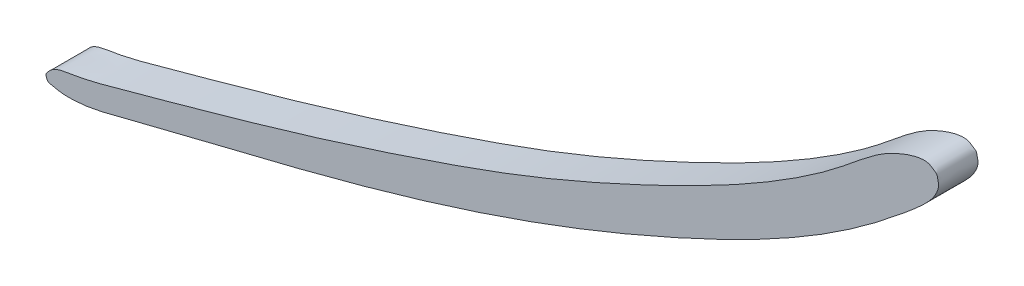
ISO-10303-21;
HEADER;
FILE_DESCRIPTION(('STEP AP214'),'2;1');
FILE_NAME('part.step','',(''),(''),'','','');
FILE_SCHEMA(('AUTOMOTIVE_DESIGN { 1 0 10303 214 1 1 1 1 }'));
ENDSEC;
DATA;
#1=APPLICATION_CONTEXT('core data for automotive mechanical design processes');
#2=APPLICATION_PROTOCOL_DEFINITION('international standard','automotive_design',2000,#1);
#3=PRODUCT_CONTEXT('',#1,'mechanical');
#4=PRODUCT('Part','Part','',(#3));
#5=PRODUCT_RELATED_PRODUCT_CATEGORY('part','',(#4));
#6=PRODUCT_DEFINITION_FORMATION('','',#4);
#7=PRODUCT_DEFINITION_CONTEXT('part definition',#1,'design');
#8=PRODUCT_DEFINITION('design','',#6,#7);
#9=PRODUCT_DEFINITION_SHAPE('','',#8);
#10=(LENGTH_UNIT() NAMED_UNIT(*) SI_UNIT(.MILLI.,.METRE.));
#11=(NAMED_UNIT(*) PLANE_ANGLE_UNIT() SI_UNIT($,.RADIAN.));
#12=(NAMED_UNIT(*) SI_UNIT($,.STERADIAN.) SOLID_ANGLE_UNIT());
#13=UNCERTAINTY_MEASURE_WITH_UNIT(LENGTH_MEASURE(1.E-05),#10,'distance_accuracy_value','');
#14=(GEOMETRIC_REPRESENTATION_CONTEXT(3) GLOBAL_UNCERTAINTY_ASSIGNED_CONTEXT((#13)) GLOBAL_UNIT_ASSIGNED_CONTEXT((#10,
#11,#12)) REPRESENTATION_CONTEXT('',''));
#15=CARTESIAN_POINT('',(0.,0.,0.));
#16=DIRECTION('',(0.,0.,1.));
#17=DIRECTION('',(1.,0.,0.));
#18=AXIS2_PLACEMENT_3D('',#15,#16,#17);
#19=CARTESIAN_POINT('',(98.4237961765209,0.,204.));
#20=CARTESIAN_POINT('',(98.3589321661085,0.117288758502057,204.));
#21=CARTESIAN_POINT('',(98.2555818104065,0.202564729120433,204.));
#22=CARTESIAN_POINT('',(98.0434410055772,0.360383273551998,204.));
#23=CARTESIAN_POINT('',(97.932651903241,0.432518645571887,204.));
#24=CARTESIAN_POINT('',(97.7147405538341,0.582053320782084,204.));
#25=CARTESIAN_POINT('',(97.6070945383644,0.658700731519124,204.));
#26=CARTESIAN_POINT('',(97.3860041879175,0.803671811644701,204.));
#27=CARTESIAN_POINT('',(97.2729771080006,0.872152390625252,204.));
#28=CARTESIAN_POINT('',(97.0421113784554,0.996923379218661,204.));
#29=CARTESIAN_POINT('',(96.9238911494931,1.05300562614126,204.));
#30=CARTESIAN_POINT('',(96.6772544975599,1.14211280535721,204.));
#31=CARTESIAN_POINT('',(96.5479832149782,1.17606558614761,204.));
#32=CARTESIAN_POINT('',(96.1566827190893,1.24805837221999,204.));
#33=CARTESIAN_POINT('',(95.8943750991064,1.25718228385665,204.));
#34=CARTESIAN_POINT('',(95.3683561808596,1.2375556731719,204.));
#35=CARTESIAN_POINT('',(95.1043952200779,1.20755742908412,204.));
#36=CARTESIAN_POINT('',(94.5851890793413,1.1290410605149,204.));
#37=CARTESIAN_POINT('',(94.3283558159556,1.07952635849101,204.));
#38=CARTESIAN_POINT('',(93.5652240787811,0.903698558430565,204.));
#39=CARTESIAN_POINT('',(93.0656348062729,0.752541475818979,204.));
#40=CARTESIAN_POINT('',(92.075151657459,0.418028501811125,204.));
#41=CARTESIAN_POINT('',(91.5834116559206,0.231781543556554,204.));
#42=CARTESIAN_POINT('',(90.6169647111378,-0.169679382355998,204.));
#43=CARTESIAN_POINT('',(90.1421614341095,-0.384188821590694,204.));
#44=CARTESIAN_POINT('',(88.7415009466479,-1.066581040701,204.));
#45=CARTESIAN_POINT('',(87.8402122547561,-1.57466823622007,204.));
#46=CARTESIAN_POINT('',(85.2294359781201,-3.2512638337366,204.));
#47=CARTESIAN_POINT('',(83.6045725553764,-4.55854135157364,204.));
#48=CARTESIAN_POINT('',(81.1809557429743,-6.54059740722059,204.));
#49=CARTESIAN_POINT('',(80.3739580712488,-7.20267557691391,204.));
#50=CARTESIAN_POINT('',(78.7471200845079,-8.50637973104047,204.));
#51=CARTESIAN_POINT('',(77.928186984075,-9.14945047418073,204.));
#52=CARTESIAN_POINT('',(75.4428163186501,-11.0331621926042,204.));
#53=CARTESIAN_POINT('',(73.7495133233628,-12.2310193931545,204.));
#54=CARTESIAN_POINT('',(70.3151937124524,-14.5507488291273,204.));
#55=CARTESIAN_POINT('',(68.5742280158222,-15.6727021541395,204.));
#56=CARTESIAN_POINT('',(65.0565810696821,-17.8597310191415,204.));
#57=CARTESIAN_POINT('',(63.2788452110654,-18.923127071479,204.));
#58=CARTESIAN_POINT('',(59.6867896536873,-20.9916586250141,204.));
#59=CARTESIAN_POINT('',(57.8730559887238,-21.9977273976211,204.));
#60=CARTESIAN_POINT('',(52.3903523713729,-24.9498398978238,204.));
#61=CARTESIAN_POINT('',(48.6805748856774,-26.8343754452145,204.));
#62=CARTESIAN_POINT('',(41.2030529247128,-30.4949366012721,204.));
#63=CARTESIAN_POINT('',(37.4360345766898,-32.2679143639587,204.));
#64=CARTESIAN_POINT('',(29.8586038119274,-35.7143856494283,204.));
#65=CARTESIAN_POINT('',(26.048209680678,-37.3877870740797,204.));
#66=CARTESIAN_POINT('',(18.3709391494823,-40.6047508024442,204.));
#67=CARTESIAN_POINT('',(14.5019665056862,-42.144779097204,204.));
#68=CARTESIAN_POINT('',(6.71499475776126,-45.0844528280911,204.));
#69=CARTESIAN_POINT('',(2.79627576798242,-46.4859230312784,204.));
#70=CARTESIAN_POINT('',(-5.07186437696641,-49.2056789198514,204.));
#71=CARTESIAN_POINT('',(-9.01892861882546,-50.5272387805856,204.));
#72=CARTESIAN_POINT('',(-16.9275999359106,-53.1211536614339,204.));
#73=CARTESIAN_POINT('',(-20.8907316749502,-54.3900527802076,204.));
#74=CARTESIAN_POINT('',(-28.8372796937721,-56.8631460427529,204.));
#75=CARTESIAN_POINT('',(-32.8215950707914,-58.0644721864548,204.));
#76=CARTESIAN_POINT('',(-40.8088573797893,-60.4076923026705,204.));
#77=CARTESIAN_POINT('',(-44.8120258100262,-61.5492743485377,204.));
#78=CARTESIAN_POINT('',(-52.8259967178262,-63.8042782013441,204.));
#79=CARTESIAN_POINT('',(-56.8363523820931,-64.919762149353,204.));
#80=CARTESIAN_POINT('',(-62.8536884081454,-66.5864405656361,204.));
#81=CARTESIAN_POINT('',(-64.8601221591046,-67.1396592709032,204.));
#82=CARTESIAN_POINT('',(-67.8728130234542,-67.9583109921843,204.));
#83=CARTESIAN_POINT('',(-68.8772983621898,-68.2303266520975,204.));
#84=CARTESIAN_POINT('',(-70.8872416283583,-68.7704663240672,204.));
#85=CARTESIAN_POINT('',(-71.8933313672218,-69.0360233140264,204.));
#86=CARTESIAN_POINT('',(-73.9184226434484,-69.5150232993401,204.));
#87=CARTESIAN_POINT('',(-74.9380438397189,-69.7279596335877,204.));
#88=CARTESIAN_POINT('',(-76.4774037910468,-69.993376720605,204.));
#89=CARTESIAN_POINT('',(-76.9929390346782,-70.0693874457591,204.));
#90=CARTESIAN_POINT('',(-78.021223797342,-70.2357819620433,204.));
#91=CARTESIAN_POINT('',(-78.5336582613484,-70.3277912931406,204.));
#92=CARTESIAN_POINT('',(-79.5462779427859,-70.5750104702872,204.));
#93=CARTESIAN_POINT('',(-80.0521897222114,-70.7300676133601,204.));
#94=CARTESIAN_POINT('',(-80.7388356335569,-71.0897726776899,204.));
#95=CARTESIAN_POINT('',(-80.9552136282382,-71.2334575455024,204.));
#96=CARTESIAN_POINT('',(-81.3605745493705,-71.5729340544302,204.));
#97=CARTESIAN_POINT('',(-81.5457338057735,-71.7607832200071,204.));
#98=CARTESIAN_POINT('',(-81.8126752572026,-72.0533550601342,204.));
#99=CARTESIAN_POINT('',(-81.902345124115,-72.1503402693543,204.));
#100=CARTESIAN_POINT('',(-82.0690975162195,-72.3548200120022,204.));
#101=CARTESIAN_POINT('',(-82.1500313206639,-72.4619947570133,204.));
#102=CARTESIAN_POINT('',(-82.2376872265412,-72.7118067539519,204.));
#103=CARTESIAN_POINT('',(-82.2312890236743,-72.8483373565183,204.));
#104=CARTESIAN_POINT('',(-82.1740978311282,-73.1034531809857,204.));
#105=CARTESIAN_POINT('',(-82.1287063033833,-73.2258548468859,204.));
#106=CARTESIAN_POINT('',(-82.0277878616467,-73.4675466782458,204.));
#107=CARTESIAN_POINT('',(-81.9713659204848,-73.58710030256,204.));
#108=CARTESIAN_POINT('',(-81.8511662045725,-73.7426997992616,204.));
#109=CARTESIAN_POINT('',(-81.8051243050416,-73.7886670128825,204.));
#110=CARTESIAN_POINT('',(-81.6986928897141,-73.866436412253,204.));
#111=CARTESIAN_POINT('',(-81.6404853886245,-73.89570866808,204.));
#112=CARTESIAN_POINT('',(-81.4553933247528,-73.9604511170911,204.));
#113=CARTESIAN_POINT('',(-81.3244124949358,-73.9777429240265,204.));
#114=CARTESIAN_POINT('',(-81.0658807812132,-74.0168100353915,204.));
#115=CARTESIAN_POINT('',(-80.9368538839538,-74.0376443030585,204.));
#116=CARTESIAN_POINT('',(-80.5516964011501,-74.1106155741245,204.));
#117=CARTESIAN_POINT('',(-80.2961149408665,-74.1671978866997,204.));
#118=CARTESIAN_POINT('',(-79.783958191111,-74.2736057923486,204.));
#119=CARTESIAN_POINT('',(-79.5272953753157,-74.3205800262019,204.));
#120=CARTESIAN_POINT('',(-78.7536694111281,-74.4227294202377,204.));
#121=CARTESIAN_POINT('',(-78.2339404013309,-74.4484224912163,204.));
#122=CARTESIAN_POINT('',(-77.1904341973943,-74.4566579056381,204.));
#123=CARTESIAN_POINT('',(-76.665573933379,-74.4405107345925,204.));
#124=CARTESIAN_POINT('',(-75.6252850724493,-74.3753966485418,204.));
#125=CARTESIAN_POINT('',(-75.1084052383143,-74.3259589867721,204.));
#126=CARTESIAN_POINT('',(-73.5663254677805,-74.1333852244265,204.));
#127=CARTESIAN_POINT('',(-72.5495482934839,-73.946696591942,204.));
#128=CARTESIAN_POINT('',(-70.5258882741403,-73.5221575958078,204.));
#129=CARTESIAN_POINT('',(-69.5189254532869,-73.2847207721365,204.));
#130=CARTESIAN_POINT('',(-66.5043179267363,-72.5399327524689,204.));
#131=CARTESIAN_POINT('',(-64.5015556014628,-72.0078598555902,204.));
#132=CARTESIAN_POINT('',(-60.4913777685565,-70.9660585225846,204.));
#133=CARTESIAN_POINT('',(-58.4845222216,-70.4519042228576,204.));
#134=CARTESIAN_POINT('',(-52.4569273000915,-68.9375235990113,204.));
#135=CARTESIAN_POINT('',(-48.430448181059,-67.9603124018771,204.));
#136=CARTESIAN_POINT('',(-40.3808189443848,-65.9928219864498,204.));
#137=CARTESIAN_POINT('',(-36.357819399125,-65.0018742489457,204.));
#138=CARTESIAN_POINT('',(-24.3117879696797,-61.9378931148375,204.));
#139=CARTESIAN_POINT('',(-16.3111272846816,-59.7742212431449,204.));
#140=CARTESIAN_POINT('',(-4.39646644650331,-56.2378309063148,204.));
#141=CARTESIAN_POINT('',(-0.437898842276075,-55.0107444243529,204.));
#142=CARTESIAN_POINT('',(7.44227041440742,-52.4502188360248,204.));
#143=CARTESIAN_POINT('',(11.3640432764207,-51.1167820823632,204.));
#144=CARTESIAN_POINT('',(19.1651517186535,-48.3266786111584,204.));
#145=CARTESIAN_POINT('',(23.0455840554734,-46.8697402868038,204.));
#146=CARTESIAN_POINT('',(30.7567518388619,-43.8385791612188,204.));
#147=CARTESIAN_POINT('',(34.5882138960533,-42.2643904228003,204.));
#148=CARTESIAN_POINT('',(42.2053815360214,-39.0048396648341,204.));
#149=CARTESIAN_POINT('',(45.9920329755738,-37.3190595989316,204.));
#150=CARTESIAN_POINT('',(53.5048481649036,-33.826433844837,204.));
#151=CARTESIAN_POINT('',(57.2320931931776,-32.0197655212075,204.));
#152=CARTESIAN_POINT('',(64.6005874015583,-28.2284500996939,204.));
#153=CARTESIAN_POINT('',(68.2407867095931,-26.2441762300591,204.));
#154=CARTESIAN_POINT('',(75.3642374384745,-22.0145822961899,204.));
#155=CARTESIAN_POINT('',(78.8505702618841,-19.7652837182563,204.));
#156=CARTESIAN_POINT('',(85.6111586394305,-14.971051113365,204.));
#157=CARTESIAN_POINT('',(88.8884359549304,-12.4259983337828,204.));
#158=CARTESIAN_POINT('',(92.8711289074404,-9.11103013605864,204.));
#159=CARTESIAN_POINT('',(93.6621040776665,-8.44081863790264,204.));
#160=CARTESIAN_POINT('',(94.8253883683933,-7.4099158627794,204.));
#161=CARTESIAN_POINT('',(95.2082905612714,-7.06091066387942,204.));
#162=CARTESIAN_POINT('',(95.9579799154325,-6.3450882371994,204.));
#163=CARTESIAN_POINT('',(96.3255135175857,-5.97927530229947,204.));
#164=CARTESIAN_POINT('',(97.0228293222722,-5.21778101583802,204.));
#165=CARTESIAN_POINT('',(97.3531400485585,-4.82182613696015,204.));
#166=CARTESIAN_POINT('',(97.9501868216155,-3.97722015407785,204.));
#167=CARTESIAN_POINT('',(98.2159976097107,-3.52337059041506,204.));
#168=CARTESIAN_POINT('',(98.5214873008474,-2.80818959566658,204.));
#169=CARTESIAN_POINT('',(98.6093253817105,-2.56226600661208,204.));
#170=CARTESIAN_POINT('',(98.7318088322529,-2.05369891213611,204.));
#171=CARTESIAN_POINT('',(98.7666466348802,-1.79654297089599,204.));
#172=CARTESIAN_POINT('',(98.7380938550477,-1.27154515254273,204.));
#173=CARTESIAN_POINT('',(98.6715293280656,-1.01592087417173,204.));
#174=CARTESIAN_POINT('',(98.5794195212941,-0.633385408965884,204.));
#175=CARTESIAN_POINT('',(98.5543324857936,-0.50477301455331,204.));
#176=CARTESIAN_POINT('',(98.5068441804649,-0.247021915638398,204.));
#177=CARTESIAN_POINT('',(98.4886601869333,-0.117288758502044,204.));
#178=CARTESIAN_POINT('',(98.4237961765209,0.,204.));
#179=B_SPLINE_CURVE_WITH_KNOTS('',3,(#19,#20,#21,#22,#23,#24,#25,#26,#27,#28,#29,#30,#31,#32,
#33,#34,#35,#36,#37,#38,#39,#40,#41,#42,#43,#44,#45,#46,#47,#48,#49,#50,#51,#52,#53,#54,#55,#56,
#57,#58,#59,#60,#61,#62,#63,#64,#65,#66,#67,#68,#69,#70,#71,#72,#73,#74,#75,#76,#77,#78,#79,#80,
#81,#82,#83,#84,#85,#86,#87,#88,#89,#90,#91,#92,#93,#94,#95,#96,#97,#98,#99,#100,#101,#102,#103,
#104,#105,#106,#107,#108,#109,#110,#111,#112,#113,#114,#115,#116,#117,#118,#119,#120,#121,#122,
#123,#124,#125,#126,#127,#128,#129,#130,#131,#132,#133,#134,#135,#136,#137,#138,#139,#140,#141,
#142,#143,#144,#145,#146,#147,#148,#149,#150,#151,#152,#153,#154,#155,#156,#157,#158,#159,#160,
#161,#162,#163,#164,#165,#166,#167,#168,#169,#170,#171,#172,#173,#174,#175,#176,#177,#178),
.UNSPECIFIED.,.T.,.F.,(4,2,2,2,2,2,2,2,2,2,2,2,2,2,2,2,2,2,2,2,2,2,2,2,2,2,2,2,2,2,2,2,2,2,2,2,
2,2,2,2,2,2,2,2,2,2,2,2,2,2,2,2,2,2,2,2,2,2,2,2,2,2,2,2,2,2,2,2,2,2,2,2,2,2,2,2,2,2,2,4),(0.,
0.000976562500000153,0.00195312500000031,0.00292968750000046,0.00390625000000061,
0.00488281250000076,0.00585937500000092,0.00781250000000112,0.00976562500000133,
0.0117187500000015,0.0156250000000019,0.0195312500000024,0.0234375000000028,0.0312500000000036,
0.0468750000000052,0.0546875000000061,0.0625000000000069,0.0781250000000086,0.0937500000000103,
0.109375000000012,0.125000000000014,0.156250000000017,0.187500000000021,0.218750000000024,
0.250000000000028,0.281250000000031,0.312500000000034,0.343750000000038,0.375000000000041,
0.406250000000045,0.437500000000048,0.45312500000005,0.460937500000051,0.468750000000052,
0.476562500000052,0.480468750000053,0.484375000000053,0.488281250000054,0.490234375000054,
0.492187500000054,0.493164062500054,0.494140625000054,0.495117187500054,0.496093750000054,
0.497070312500054,0.497558593750054,0.498046875000054,0.499023437500054,0.500000000000054,
0.501953125000054,0.503906250000054,0.507812500000053,0.511718750000053,0.515625000000052,
0.523437500000051,0.53125000000005,0.546875000000049,0.562500000000047,0.593750000000044,
0.62500000000004,0.687500000000033,0.71875000000003,0.750000000000027,0.781250000000023,
0.81250000000002,0.843750000000017,0.875000000000013,0.90625000000001,0.937500000000007,
0.968750000000003,0.976562500000002,0.980468750000002,0.984375000000002,0.988281250000001,
0.992187500000001,0.994140625000001,0.99609375,0.998046875,0.9990234375,1.),.UNSPECIFIED.);
#180=DIRECTION('',(0.,0.,-1.));
#181=VECTOR('',#180,1.);
#182=SURFACE_OF_LINEAR_EXTRUSION('',#179,#181);
#183=CARTESIAN_POINT('',(98.4237961765209,0.,204.));
#184=CARTESIAN_POINT('',(98.4886601869333,-0.117288758502044,204.));
#185=CARTESIAN_POINT('',(98.5068441804649,-0.247021915638398,204.));
#186=CARTESIAN_POINT('',(98.5543324857936,-0.50477301455331,204.));
#187=CARTESIAN_POINT('',(98.5794195212941,-0.633385408965884,204.));
#188=CARTESIAN_POINT('',(98.6715293280656,-1.01592087417173,204.));
#189=CARTESIAN_POINT('',(98.7380938550477,-1.27154515254273,204.));
#190=CARTESIAN_POINT('',(98.7666466348802,-1.79654297089599,204.));
#191=CARTESIAN_POINT('',(98.7318088322529,-2.05369891213611,204.));
#192=CARTESIAN_POINT('',(98.6093253817105,-2.56226600661208,204.));
#193=CARTESIAN_POINT('',(98.5214873008474,-2.80818959566658,204.));
#194=CARTESIAN_POINT('',(98.2159976097107,-3.52337059041506,204.));
#195=CARTESIAN_POINT('',(97.9501868216155,-3.97722015407785,204.));
#196=CARTESIAN_POINT('',(97.3531400485585,-4.82182613696015,204.));
#197=CARTESIAN_POINT('',(97.0228293222722,-5.21778101583802,204.));
#198=CARTESIAN_POINT('',(96.3255135175857,-5.97927530229947,204.));
#199=CARTESIAN_POINT('',(95.9579799154325,-6.3450882371994,204.));
#200=CARTESIAN_POINT('',(95.2082905612714,-7.06091066387942,204.));
#201=CARTESIAN_POINT('',(94.8253883683933,-7.4099158627794,204.));
#202=CARTESIAN_POINT('',(93.6621040776665,-8.44081863790264,204.));
#203=CARTESIAN_POINT('',(92.8711289074404,-9.11103013605864,204.));
#204=CARTESIAN_POINT('',(88.8884359549304,-12.4259983337828,204.));
#205=CARTESIAN_POINT('',(85.6111586394305,-14.971051113365,204.));
#206=CARTESIAN_POINT('',(78.8505702618841,-19.7652837182563,204.));
#207=CARTESIAN_POINT('',(75.3642374384745,-22.0145822961899,204.));
#208=CARTESIAN_POINT('',(68.2407867095931,-26.2441762300591,204.));
#209=CARTESIAN_POINT('',(64.6005874015583,-28.2284500996939,204.));
#210=CARTESIAN_POINT('',(57.2320931931776,-32.0197655212075,204.));
#211=CARTESIAN_POINT('',(53.5048481649036,-33.826433844837,204.));
#212=CARTESIAN_POINT('',(45.9920329755738,-37.3190595989316,204.));
#213=CARTESIAN_POINT('',(42.2053815360214,-39.0048396648341,204.));
#214=CARTESIAN_POINT('',(34.5882138960533,-42.2643904228003,204.));
#215=CARTESIAN_POINT('',(30.7567518388619,-43.8385791612188,204.));
#216=CARTESIAN_POINT('',(23.0455840554734,-46.8697402868038,204.));
#217=CARTESIAN_POINT('',(19.1651517186535,-48.3266786111584,204.));
#218=CARTESIAN_POINT('',(11.3640432764207,-51.1167820823632,204.));
#219=CARTESIAN_POINT('',(7.44227041440742,-52.4502188360248,204.));
#220=CARTESIAN_POINT('',(-0.437898842276075,-55.0107444243529,204.));
#221=CARTESIAN_POINT('',(-4.39646644650331,-56.2378309063148,204.));
#222=CARTESIAN_POINT('',(-16.3111272846816,-59.7742212431449,204.));
#223=CARTESIAN_POINT('',(-24.3117879696797,-61.9378931148375,204.));
#224=CARTESIAN_POINT('',(-36.357819399125,-65.0018742489457,204.));
#225=CARTESIAN_POINT('',(-40.3808189443848,-65.9928219864498,204.));
#226=CARTESIAN_POINT('',(-48.430448181059,-67.9603124018771,204.));
#227=CARTESIAN_POINT('',(-52.4569273000915,-68.9375235990113,204.));
#228=CARTESIAN_POINT('',(-58.4845222216,-70.4519042228576,204.));
#229=CARTESIAN_POINT('',(-60.4913777685565,-70.9660585225846,204.));
#230=CARTESIAN_POINT('',(-64.5015556014628,-72.0078598555902,204.));
#231=CARTESIAN_POINT('',(-66.5043179267363,-72.5399327524689,204.));
#232=CARTESIAN_POINT('',(-69.5189254532869,-73.2847207721365,204.));
#233=CARTESIAN_POINT('',(-70.5258882741403,-73.5221575958078,204.));
#234=CARTESIAN_POINT('',(-72.5495482934839,-73.946696591942,204.));
#235=CARTESIAN_POINT('',(-73.5663254677805,-74.1333852244265,204.));
#236=CARTESIAN_POINT('',(-75.1084052383143,-74.3259589867721,204.));
#237=CARTESIAN_POINT('',(-75.6252850724493,-74.3753966485418,204.));
#238=CARTESIAN_POINT('',(-76.665573933379,-74.4405107345925,204.));
#239=CARTESIAN_POINT('',(-77.1904341973943,-74.4566579056381,204.));
#240=CARTESIAN_POINT('',(-78.2339404013309,-74.4484224912163,204.));
#241=CARTESIAN_POINT('',(-78.7536694111281,-74.4227294202377,204.));
#242=CARTESIAN_POINT('',(-79.5272953753157,-74.3205800262019,204.));
#243=CARTESIAN_POINT('',(-79.783958191111,-74.2736057923486,204.));
#244=CARTESIAN_POINT('',(-80.2961149408665,-74.1671978866997,204.));
#245=CARTESIAN_POINT('',(-80.5516964011501,-74.1106155741245,204.));
#246=CARTESIAN_POINT('',(-80.9368538839538,-74.0376443030585,204.));
#247=CARTESIAN_POINT('',(-81.0658807812132,-74.0168100353915,204.));
#248=CARTESIAN_POINT('',(-81.3244124949358,-73.9777429240265,204.));
#249=CARTESIAN_POINT('',(-81.4553933247528,-73.9604511170911,204.));
#250=CARTESIAN_POINT('',(-81.6404853886245,-73.89570866808,204.));
#251=CARTESIAN_POINT('',(-81.6986928897141,-73.866436412253,204.));
#252=CARTESIAN_POINT('',(-81.8051243050416,-73.7886670128825,204.));
#253=CARTESIAN_POINT('',(-81.8511662045725,-73.7426997992616,204.));
#254=CARTESIAN_POINT('',(-81.9713659204848,-73.58710030256,204.));
#255=CARTESIAN_POINT('',(-82.0277878616467,-73.4675466782458,204.));
#256=CARTESIAN_POINT('',(-82.1287063033833,-73.2258548468859,204.));
#257=CARTESIAN_POINT('',(-82.1740978311282,-73.1034531809857,204.));
#258=CARTESIAN_POINT('',(-82.2312890236743,-72.8483373565183,204.));
#259=CARTESIAN_POINT('',(-82.2376872265412,-72.7118067539519,204.));
#260=CARTESIAN_POINT('',(-82.1500313206639,-72.4619947570133,204.));
#261=CARTESIAN_POINT('',(-82.0690975162195,-72.3548200120022,204.));
#262=CARTESIAN_POINT('',(-81.902345124115,-72.1503402693543,204.));
#263=CARTESIAN_POINT('',(-81.8126752572026,-72.0533550601342,204.));
#264=CARTESIAN_POINT('',(-81.5457338057735,-71.7607832200071,204.));
#265=CARTESIAN_POINT('',(-81.3605745493705,-71.5729340544302,204.));
#266=CARTESIAN_POINT('',(-80.9552136282382,-71.2334575455024,204.));
#267=CARTESIAN_POINT('',(-80.7388356335569,-71.0897726776899,204.));
#268=CARTESIAN_POINT('',(-80.0521897222114,-70.7300676133601,204.));
#269=CARTESIAN_POINT('',(-79.5462779427859,-70.5750104702872,204.));
#270=CARTESIAN_POINT('',(-78.5336582613484,-70.3277912931406,204.));
#271=CARTESIAN_POINT('',(-78.021223797342,-70.2357819620433,204.));
#272=CARTESIAN_POINT('',(-76.9929390346782,-70.0693874457591,204.));
#273=CARTESIAN_POINT('',(-76.4774037910468,-69.993376720605,204.));
#274=CARTESIAN_POINT('',(-74.9380438397189,-69.7279596335877,204.));
#275=CARTESIAN_POINT('',(-73.9184226434484,-69.5150232993401,204.));
#276=CARTESIAN_POINT('',(-71.8933313672218,-69.0360233140264,204.));
#277=CARTESIAN_POINT('',(-70.8872416283583,-68.7704663240672,204.));
#278=CARTESIAN_POINT('',(-68.8772983621898,-68.2303266520975,204.));
#279=CARTESIAN_POINT('',(-67.8728130234542,-67.9583109921843,204.));
#280=CARTESIAN_POINT('',(-64.8601221591046,-67.1396592709032,204.));
#281=CARTESIAN_POINT('',(-62.8536884081454,-66.5864405656361,204.));
#282=CARTESIAN_POINT('',(-56.8363523820931,-64.919762149353,204.));
#283=CARTESIAN_POINT('',(-52.8259967178262,-63.8042782013441,204.));
#284=CARTESIAN_POINT('',(-44.8120258100262,-61.5492743485377,204.));
#285=CARTESIAN_POINT('',(-40.8088573797893,-60.4076923026705,204.));
#286=CARTESIAN_POINT('',(-32.8215950707914,-58.0644721864548,204.));
#287=CARTESIAN_POINT('',(-28.8372796937721,-56.8631460427529,204.));
#288=CARTESIAN_POINT('',(-20.8907316749502,-54.3900527802076,204.));
#289=CARTESIAN_POINT('',(-16.9275999359106,-53.1211536614339,204.));
#290=CARTESIAN_POINT('',(-9.01892861882546,-50.5272387805856,204.));
#291=CARTESIAN_POINT('',(-5.07186437696641,-49.2056789198514,204.));
#292=CARTESIAN_POINT('',(2.79627576798242,-46.4859230312784,204.));
#293=CARTESIAN_POINT('',(6.71499475776126,-45.0844528280911,204.));
#294=CARTESIAN_POINT('',(14.5019665056862,-42.144779097204,204.));
#295=CARTESIAN_POINT('',(18.3709391494823,-40.6047508024442,204.));
#296=CARTESIAN_POINT('',(26.048209680678,-37.3877870740797,204.));
#297=CARTESIAN_POINT('',(29.8586038119274,-35.7143856494283,204.));
#298=CARTESIAN_POINT('',(37.4360345766898,-32.2679143639587,204.));
#299=CARTESIAN_POINT('',(41.2030529247128,-30.4949366012721,204.));
#300=CARTESIAN_POINT('',(48.6805748856774,-26.8343754452145,204.));
#301=CARTESIAN_POINT('',(52.3903523713729,-24.9498398978238,204.));
#302=CARTESIAN_POINT('',(57.8730559887238,-21.9977273976211,204.));
#303=CARTESIAN_POINT('',(59.6867896536873,-20.9916586250141,204.));
#304=CARTESIAN_POINT('',(63.2788452110654,-18.923127071479,204.));
#305=CARTESIAN_POINT('',(65.0565810696821,-17.8597310191415,204.));
#306=CARTESIAN_POINT('',(68.5742280158222,-15.6727021541395,204.));
#307=CARTESIAN_POINT('',(70.3151937124524,-14.5507488291273,204.));
#308=CARTESIAN_POINT('',(73.7495133233628,-12.2310193931545,204.));
#309=CARTESIAN_POINT('',(75.4428163186501,-11.0331621926042,204.));
#310=CARTESIAN_POINT('',(77.928186984075,-9.14945047418073,204.));
#311=CARTESIAN_POINT('',(78.7471200845079,-8.50637973104047,204.));
#312=CARTESIAN_POINT('',(80.3739580712488,-7.20267557691391,204.));
#313=CARTESIAN_POINT('',(81.1809557429743,-6.54059740722059,204.));
#314=CARTESIAN_POINT('',(83.6045725553764,-4.55854135157364,204.));
#315=CARTESIAN_POINT('',(85.2294359781201,-3.2512638337366,204.));
#316=CARTESIAN_POINT('',(87.8402122547561,-1.57466823622007,204.));
#317=CARTESIAN_POINT('',(88.7415009466479,-1.066581040701,204.));
#318=CARTESIAN_POINT('',(90.1421614341095,-0.384188821590694,204.));
#319=CARTESIAN_POINT('',(90.6169647111378,-0.169679382355998,204.));
#320=CARTESIAN_POINT('',(91.5834116559206,0.231781543556554,204.));
#321=CARTESIAN_POINT('',(92.075151657459,0.418028501811125,204.));
#322=CARTESIAN_POINT('',(93.0656348062729,0.752541475818979,204.));
#323=CARTESIAN_POINT('',(93.5652240787811,0.903698558430565,204.));
#324=CARTESIAN_POINT('',(94.3283558159556,1.07952635849101,204.));
#325=CARTESIAN_POINT('',(94.5851890793413,1.1290410605149,204.));
#326=CARTESIAN_POINT('',(95.1043952200779,1.20755742908412,204.));
#327=CARTESIAN_POINT('',(95.3683561808596,1.2375556731719,204.));
#328=CARTESIAN_POINT('',(95.8943750991064,1.25718228385665,204.));
#329=CARTESIAN_POINT('',(96.1566827190893,1.24805837221999,204.));
#330=CARTESIAN_POINT('',(96.5479832149782,1.17606558614761,204.));
#331=CARTESIAN_POINT('',(96.6772544975599,1.14211280535721,204.));
#332=CARTESIAN_POINT('',(96.9238911494931,1.05300562614126,204.));
#333=CARTESIAN_POINT('',(97.0421113784554,0.996923379218661,204.));
#334=CARTESIAN_POINT('',(97.2729771080006,0.872152390625252,204.));
#335=CARTESIAN_POINT('',(97.3860041879175,0.803671811644701,204.));
#336=CARTESIAN_POINT('',(97.6070945383644,0.658700731519124,204.));
#337=CARTESIAN_POINT('',(97.7147405538341,0.582053320782084,204.));
#338=CARTESIAN_POINT('',(97.932651903241,0.432518645571887,204.));
#339=CARTESIAN_POINT('',(98.0434410055772,0.360383273551998,204.));
#340=CARTESIAN_POINT('',(98.2555818104065,0.202564729120433,204.));
#341=CARTESIAN_POINT('',(98.3589321661085,0.117288758502057,204.));
#342=CARTESIAN_POINT('',(98.4237961765209,0.,204.));
#343=B_SPLINE_CURVE_WITH_KNOTS('',3,(#183,#184,#185,#186,#187,#188,#189,#190,#191,#192,#193,
#194,#195,#196,#197,#198,#199,#200,#201,#202,#203,#204,#205,#206,#207,#208,#209,#210,#211,#212,
#213,#214,#215,#216,#217,#218,#219,#220,#221,#222,#223,#224,#225,#226,#227,#228,#229,#230,#231,
#232,#233,#234,#235,#236,#237,#238,#239,#240,#241,#242,#243,#244,#245,#246,#247,#248,#249,#250,
#251,#252,#253,#254,#255,#256,#257,#258,#259,#260,#261,#262,#263,#264,#265,#266,#267,#268,#269,
#270,#271,#272,#273,#274,#275,#276,#277,#278,#279,#280,#281,#282,#283,#284,#285,#286,#287,#288,
#289,#290,#291,#292,#293,#294,#295,#296,#297,#298,#299,#300,#301,#302,#303,#304,#305,#306,#307,
#308,#309,#310,#311,#312,#313,#314,#315,#316,#317,#318,#319,#320,#321,#322,#323,#324,#325,#326,
#327,#328,#329,#330,#331,#332,#333,#334,#335,#336,#337,#338,#339,#340,#341,#342),.UNSPECIFIED.,
.T.,.F.,(4,2,2,2,2,2,2,2,2,2,2,2,2,2,2,2,2,2,2,2,2,2,2,2,2,2,2,2,2,2,2,2,2,2,2,2,2,2,2,2,2,2,2,
2,2,2,2,2,2,2,2,2,2,2,2,2,2,2,2,2,2,2,2,2,2,2,2,2,2,2,2,2,2,2,2,2,2,2,2,4),(0.,
0.000976562499999889,0.00195312499999989,0.00390624999999967,0.00585937499999933,
0.00781249999999911,0.0117187499999988,0.0156249999999983,0.019531249999998,0.0234374999999976,
0.0312499999999967,0.0624999999999933,0.09374999999999,0.124999999999987,0.156249999999983,
0.18749999999998,0.218749999999977,0.249999999999973,0.28124999999997,0.312499999999967,
0.37499999999996,0.406249999999956,0.437499999999953,0.453124999999951,0.46874999999995,
0.476562499999949,0.484374999999948,0.488281249999947,0.492187499999947,0.496093749999946,
0.498046874999946,0.499999999999946,0.500976562499946,0.501953124999946,0.502441406249946,
0.502929687499946,0.503906249999946,0.504882812499946,0.505859374999946,0.506835937499946,
0.507812499999946,0.509765624999946,0.511718749999946,0.515624999999947,0.519531249999947,
0.523437499999948,0.531249999999948,0.539062499999949,0.54687499999995,0.562499999999952,
0.593749999999955,0.624999999999959,0.656249999999962,0.687499999999966,0.718749999999969,
0.749999999999972,0.781249999999976,0.812499999999979,0.843749999999983,0.874999999999986,
0.890624999999988,0.90624999999999,0.921874999999991,0.937499999999993,0.945312499999994,
0.953124999999995,0.968749999999996,0.976562499999997,0.980468749999998,0.984374999999998,
0.988281249999998,0.990234374999999,0.992187499999999,0.994140624999999,0.995117187499999,
0.996093749999999,0.9970703125,0.998046875,0.9990234375,1.),.UNSPECIFIED.);
#344=CARTESIAN_POINT('',(98.4237961765209,0.,204.));
#345=VERTEX_POINT('',#344);
#346=EDGE_CURVE('E10',#345,#345,#343,.F.);
#347=ORIENTED_EDGE('',*,*,#346,.F.);
#348=EDGE_LOOP('',(#347));
#349=FACE_BOUND('',#348,.T.);
#350=CARTESIAN_POINT('',(98.4237961765209,0.,196.));
#351=CARTESIAN_POINT('',(98.3589321661085,0.117288758502057,196.));
#352=CARTESIAN_POINT('',(98.2555818104065,0.202564729120433,196.));
#353=CARTESIAN_POINT('',(98.0434410055772,0.360383273551998,196.));
#354=CARTESIAN_POINT('',(97.932651903241,0.432518645571887,196.));
#355=CARTESIAN_POINT('',(97.7147405538341,0.582053320782084,196.));
#356=CARTESIAN_POINT('',(97.6070945383644,0.658700731519124,196.));
#357=CARTESIAN_POINT('',(97.3860041879175,0.803671811644701,196.));
#358=CARTESIAN_POINT('',(97.2729771080006,0.872152390625252,196.));
#359=CARTESIAN_POINT('',(97.0421113784554,0.996923379218661,196.));
#360=CARTESIAN_POINT('',(96.9238911494931,1.05300562614126,196.));
#361=CARTESIAN_POINT('',(96.6772544975599,1.14211280535721,196.));
#362=CARTESIAN_POINT('',(96.5479832149782,1.17606558614761,196.));
#363=CARTESIAN_POINT('',(96.1566827190893,1.24805837221999,196.));
#364=CARTESIAN_POINT('',(95.8943750991064,1.25718228385665,196.));
#365=CARTESIAN_POINT('',(95.3683561808596,1.2375556731719,196.));
#366=CARTESIAN_POINT('',(95.1043952200779,1.20755742908412,196.));
#367=CARTESIAN_POINT('',(94.5851890793413,1.1290410605149,196.));
#368=CARTESIAN_POINT('',(94.3283558159556,1.07952635849101,196.));
#369=CARTESIAN_POINT('',(93.5652240787811,0.903698558430565,196.));
#370=CARTESIAN_POINT('',(93.0656348062729,0.752541475818979,196.));
#371=CARTESIAN_POINT('',(92.075151657459,0.418028501811125,196.));
#372=CARTESIAN_POINT('',(91.5834116559206,0.231781543556554,196.));
#373=CARTESIAN_POINT('',(90.6169647111378,-0.169679382355998,196.));
#374=CARTESIAN_POINT('',(90.1421614341095,-0.384188821590694,196.));
#375=CARTESIAN_POINT('',(88.7415009466479,-1.066581040701,196.));
#376=CARTESIAN_POINT('',(87.8402122547561,-1.57466823622007,196.));
#377=CARTESIAN_POINT('',(85.2294359781201,-3.2512638337366,196.));
#378=CARTESIAN_POINT('',(83.6045725553764,-4.55854135157364,196.));
#379=CARTESIAN_POINT('',(81.1809557429743,-6.54059740722059,196.));
#380=CARTESIAN_POINT('',(80.3739580712488,-7.20267557691391,196.));
#381=CARTESIAN_POINT('',(78.7471200845079,-8.50637973104047,196.));
#382=CARTESIAN_POINT('',(77.928186984075,-9.14945047418073,196.));
#383=CARTESIAN_POINT('',(75.4428163186501,-11.0331621926042,196.));
#384=CARTESIAN_POINT('',(73.7495133233628,-12.2310193931545,196.));
#385=CARTESIAN_POINT('',(70.3151937124524,-14.5507488291273,196.));
#386=CARTESIAN_POINT('',(68.5742280158222,-15.6727021541395,196.));
#387=CARTESIAN_POINT('',(65.0565810696821,-17.8597310191415,196.));
#388=CARTESIAN_POINT('',(63.2788452110654,-18.923127071479,196.));
#389=CARTESIAN_POINT('',(59.6867896536873,-20.9916586250141,196.));
#390=CARTESIAN_POINT('',(57.8730559887238,-21.9977273976211,196.));
#391=CARTESIAN_POINT('',(52.3903523713729,-24.9498398978238,196.));
#392=CARTESIAN_POINT('',(48.6805748856774,-26.8343754452145,196.));
#393=CARTESIAN_POINT('',(41.2030529247128,-30.4949366012721,196.));
#394=CARTESIAN_POINT('',(37.4360345766898,-32.2679143639587,196.));
#395=CARTESIAN_POINT('',(29.8586038119274,-35.7143856494283,196.));
#396=CARTESIAN_POINT('',(26.048209680678,-37.3877870740797,196.));
#397=CARTESIAN_POINT('',(18.3709391494823,-40.6047508024442,196.));
#398=CARTESIAN_POINT('',(14.5019665056862,-42.144779097204,196.));
#399=CARTESIAN_POINT('',(6.71499475776126,-45.0844528280911,196.));
#400=CARTESIAN_POINT('',(2.79627576798242,-46.4859230312784,196.));
#401=CARTESIAN_POINT('',(-5.07186437696641,-49.2056789198514,196.));
#402=CARTESIAN_POINT('',(-9.01892861882546,-50.5272387805856,196.));
#403=CARTESIAN_POINT('',(-16.9275999359106,-53.1211536614339,196.));
#404=CARTESIAN_POINT('',(-20.8907316749502,-54.3900527802076,196.));
#405=CARTESIAN_POINT('',(-28.8372796937721,-56.8631460427529,196.));
#406=CARTESIAN_POINT('',(-32.8215950707914,-58.0644721864548,196.));
#407=CARTESIAN_POINT('',(-40.8088573797893,-60.4076923026705,196.));
#408=CARTESIAN_POINT('',(-44.8120258100262,-61.5492743485377,196.));
#409=CARTESIAN_POINT('',(-52.8259967178262,-63.8042782013441,196.));
#410=CARTESIAN_POINT('',(-56.8363523820931,-64.919762149353,196.));
#411=CARTESIAN_POINT('',(-62.8536884081454,-66.5864405656361,196.));
#412=CARTESIAN_POINT('',(-64.8601221591046,-67.1396592709032,196.));
#413=CARTESIAN_POINT('',(-67.8728130234542,-67.9583109921843,196.));
#414=CARTESIAN_POINT('',(-68.8772983621898,-68.2303266520975,196.));
#415=CARTESIAN_POINT('',(-70.8872416283583,-68.7704663240672,196.));
#416=CARTESIAN_POINT('',(-71.8933313672218,-69.0360233140264,196.));
#417=CARTESIAN_POINT('',(-73.9184226434484,-69.5150232993401,196.));
#418=CARTESIAN_POINT('',(-74.9380438397189,-69.7279596335877,196.));
#419=CARTESIAN_POINT('',(-76.4774037910468,-69.993376720605,196.));
#420=CARTESIAN_POINT('',(-76.9929390346782,-70.0693874457591,196.));
#421=CARTESIAN_POINT('',(-78.021223797342,-70.2357819620433,196.));
#422=CARTESIAN_POINT('',(-78.5336582613484,-70.3277912931406,196.));
#423=CARTESIAN_POINT('',(-79.5462779427859,-70.5750104702872,196.));
#424=CARTESIAN_POINT('',(-80.0521897222114,-70.7300676133601,196.));
#425=CARTESIAN_POINT('',(-80.7388356335569,-71.0897726776899,196.));
#426=CARTESIAN_POINT('',(-80.9552136282382,-71.2334575455024,196.));
#427=CARTESIAN_POINT('',(-81.3605745493705,-71.5729340544302,196.));
#428=CARTESIAN_POINT('',(-81.5457338057735,-71.7607832200071,196.));
#429=CARTESIAN_POINT('',(-81.8126752572026,-72.0533550601342,196.));
#430=CARTESIAN_POINT('',(-81.902345124115,-72.1503402693543,196.));
#431=CARTESIAN_POINT('',(-82.0690975162195,-72.3548200120022,196.));
#432=CARTESIAN_POINT('',(-82.1500313206639,-72.4619947570133,196.));
#433=CARTESIAN_POINT('',(-82.2376872265412,-72.7118067539519,196.));
#434=CARTESIAN_POINT('',(-82.2312890236743,-72.8483373565183,196.));
#435=CARTESIAN_POINT('',(-82.1740978311282,-73.1034531809857,196.));
#436=CARTESIAN_POINT('',(-82.1287063033833,-73.2258548468859,196.));
#437=CARTESIAN_POINT('',(-82.0277878616467,-73.4675466782458,196.));
#438=CARTESIAN_POINT('',(-81.9713659204848,-73.58710030256,196.));
#439=CARTESIAN_POINT('',(-81.8511662045725,-73.7426997992616,196.));
#440=CARTESIAN_POINT('',(-81.8051243050416,-73.7886670128825,196.));
#441=CARTESIAN_POINT('',(-81.6986928897141,-73.866436412253,196.));
#442=CARTESIAN_POINT('',(-81.6404853886245,-73.89570866808,196.));
#443=CARTESIAN_POINT('',(-81.4553933247528,-73.9604511170911,196.));
#444=CARTESIAN_POINT('',(-81.3244124949358,-73.9777429240265,196.));
#445=CARTESIAN_POINT('',(-81.0658807812132,-74.0168100353915,196.));
#446=CARTESIAN_POINT('',(-80.9368538839538,-74.0376443030585,196.));
#447=CARTESIAN_POINT('',(-80.5516964011501,-74.1106155741245,196.));
#448=CARTESIAN_POINT('',(-80.2961149408665,-74.1671978866997,196.));
#449=CARTESIAN_POINT('',(-79.783958191111,-74.2736057923486,196.));
#450=CARTESIAN_POINT('',(-79.5272953753157,-74.3205800262019,196.));
#451=CARTESIAN_POINT('',(-78.7536694111281,-74.4227294202377,196.));
#452=CARTESIAN_POINT('',(-78.2339404013309,-74.4484224912163,196.));
#453=CARTESIAN_POINT('',(-77.1904341973943,-74.4566579056381,196.));
#454=CARTESIAN_POINT('',(-76.665573933379,-74.4405107345925,196.));
#455=CARTESIAN_POINT('',(-75.6252850724493,-74.3753966485418,196.));
#456=CARTESIAN_POINT('',(-75.1084052383143,-74.3259589867721,196.));
#457=CARTESIAN_POINT('',(-73.5663254677805,-74.1333852244265,196.));
#458=CARTESIAN_POINT('',(-72.5495482934839,-73.946696591942,196.));
#459=CARTESIAN_POINT('',(-70.5258882741403,-73.5221575958078,196.));
#460=CARTESIAN_POINT('',(-69.5189254532869,-73.2847207721365,196.));
#461=CARTESIAN_POINT('',(-66.5043179267363,-72.5399327524689,196.));
#462=CARTESIAN_POINT('',(-64.5015556014628,-72.0078598555902,196.));
#463=CARTESIAN_POINT('',(-60.4913777685565,-70.9660585225846,196.));
#464=CARTESIAN_POINT('',(-58.4845222216,-70.4519042228576,196.));
#465=CARTESIAN_POINT('',(-52.4569273000915,-68.9375235990113,196.));
#466=CARTESIAN_POINT('',(-48.430448181059,-67.9603124018771,196.));
#467=CARTESIAN_POINT('',(-40.3808189443848,-65.9928219864498,196.));
#468=CARTESIAN_POINT('',(-36.357819399125,-65.0018742489457,196.));
#469=CARTESIAN_POINT('',(-24.3117879696797,-61.9378931148375,196.));
#470=CARTESIAN_POINT('',(-16.3111272846816,-59.7742212431449,196.));
#471=CARTESIAN_POINT('',(-4.39646644650331,-56.2378309063148,196.));
#472=CARTESIAN_POINT('',(-0.437898842276075,-55.0107444243529,196.));
#473=CARTESIAN_POINT('',(7.44227041440742,-52.4502188360248,196.));
#474=CARTESIAN_POINT('',(11.3640432764207,-51.1167820823632,196.));
#475=CARTESIAN_POINT('',(19.1651517186535,-48.3266786111584,196.));
#476=CARTESIAN_POINT('',(23.0455840554734,-46.8697402868038,196.));
#477=CARTESIAN_POINT('',(30.7567518388619,-43.8385791612188,196.));
#478=CARTESIAN_POINT('',(34.5882138960533,-42.2643904228003,196.));
#479=CARTESIAN_POINT('',(42.2053815360214,-39.0048396648341,196.));
#480=CARTESIAN_POINT('',(45.9920329755738,-37.3190595989316,196.));
#481=CARTESIAN_POINT('',(53.5048481649036,-33.826433844837,196.));
#482=CARTESIAN_POINT('',(57.2320931931776,-32.0197655212075,196.));
#483=CARTESIAN_POINT('',(64.6005874015583,-28.2284500996939,196.));
#484=CARTESIAN_POINT('',(68.2407867095931,-26.2441762300591,196.));
#485=CARTESIAN_POINT('',(75.3642374384745,-22.0145822961899,196.));
#486=CARTESIAN_POINT('',(78.8505702618841,-19.7652837182563,196.));
#487=CARTESIAN_POINT('',(85.6111586394305,-14.971051113365,196.));
#488=CARTESIAN_POINT('',(88.8884359549304,-12.4259983337828,196.));
#489=CARTESIAN_POINT('',(92.8711289074404,-9.11103013605864,196.));
#490=CARTESIAN_POINT('',(93.6621040776665,-8.44081863790264,196.));
#491=CARTESIAN_POINT('',(94.8253883683933,-7.4099158627794,196.));
#492=CARTESIAN_POINT('',(95.2082905612714,-7.06091066387942,196.));
#493=CARTESIAN_POINT('',(95.9579799154325,-6.3450882371994,196.));
#494=CARTESIAN_POINT('',(96.3255135175857,-5.97927530229947,196.));
#495=CARTESIAN_POINT('',(97.0228293222722,-5.21778101583802,196.));
#496=CARTESIAN_POINT('',(97.3531400485585,-4.82182613696015,196.));
#497=CARTESIAN_POINT('',(97.9501868216155,-3.97722015407785,196.));
#498=CARTESIAN_POINT('',(98.2159976097107,-3.52337059041506,196.));
#499=CARTESIAN_POINT('',(98.5214873008474,-2.80818959566658,196.));
#500=CARTESIAN_POINT('',(98.6093253817105,-2.56226600661208,196.));
#501=CARTESIAN_POINT('',(98.7318088322529,-2.05369891213611,196.));
#502=CARTESIAN_POINT('',(98.7666466348802,-1.79654297089599,196.));
#503=CARTESIAN_POINT('',(98.7380938550477,-1.27154515254273,196.));
#504=CARTESIAN_POINT('',(98.6715293280656,-1.01592087417173,196.));
#505=CARTESIAN_POINT('',(98.5794195212941,-0.633385408965884,196.));
#506=CARTESIAN_POINT('',(98.5543324857936,-0.50477301455331,196.));
#507=CARTESIAN_POINT('',(98.5068441804649,-0.247021915638398,196.));
#508=CARTESIAN_POINT('',(98.4886601869333,-0.117288758502044,196.));
#509=CARTESIAN_POINT('',(98.4237961765209,0.,196.));
#510=B_SPLINE_CURVE_WITH_KNOTS('',3,(#350,#351,#352,#353,#354,#355,#356,#357,#358,#359,#360,
#361,#362,#363,#364,#365,#366,#367,#368,#369,#370,#371,#372,#373,#374,#375,#376,#377,#378,#379,
#380,#381,#382,#383,#384,#385,#386,#387,#388,#389,#390,#391,#392,#393,#394,#395,#396,#397,#398,
#399,#400,#401,#402,#403,#404,#405,#406,#407,#408,#409,#410,#411,#412,#413,#414,#415,#416,#417,
#418,#419,#420,#421,#422,#423,#424,#425,#426,#427,#428,#429,#430,#431,#432,#433,#434,#435,#436,
#437,#438,#439,#440,#441,#442,#443,#444,#445,#446,#447,#448,#449,#450,#451,#452,#453,#454,#455,
#456,#457,#458,#459,#460,#461,#462,#463,#464,#465,#466,#467,#468,#469,#470,#471,#472,#473,#474,
#475,#476,#477,#478,#479,#480,#481,#482,#483,#484,#485,#486,#487,#488,#489,#490,#491,#492,#493,
#494,#495,#496,#497,#498,#499,#500,#501,#502,#503,#504,#505,#506,#507,#508,#509),.UNSPECIFIED.,
.T.,.F.,(4,2,2,2,2,2,2,2,2,2,2,2,2,2,2,2,2,2,2,2,2,2,2,2,2,2,2,2,2,2,2,2,2,2,2,2,2,2,2,2,2,2,2,
2,2,2,2,2,2,2,2,2,2,2,2,2,2,2,2,2,2,2,2,2,2,2,2,2,2,2,2,2,2,2,2,2,2,2,2,4),(0.,
0.000976562500000153,0.00195312500000031,0.00292968750000046,0.00390625000000061,
0.00488281250000076,0.00585937500000092,0.00781250000000112,0.00976562500000133,
0.0117187500000015,0.0156250000000019,0.0195312500000024,0.0234375000000028,0.0312500000000036,
0.0468750000000052,0.0546875000000061,0.0625000000000069,0.0781250000000086,0.0937500000000103,
0.109375000000012,0.125000000000014,0.156250000000017,0.187500000000021,0.218750000000024,
0.250000000000028,0.281250000000031,0.312500000000034,0.343750000000038,0.375000000000041,
0.406250000000045,0.437500000000048,0.45312500000005,0.460937500000051,0.468750000000052,
0.476562500000052,0.480468750000053,0.484375000000053,0.488281250000054,0.490234375000054,
0.492187500000054,0.493164062500054,0.494140625000054,0.495117187500054,0.496093750000054,
0.497070312500054,0.497558593750054,0.498046875000054,0.499023437500054,0.500000000000054,
0.501953125000054,0.503906250000054,0.507812500000053,0.511718750000053,0.515625000000052,
0.523437500000051,0.53125000000005,0.546875000000049,0.562500000000047,0.593750000000044,
0.62500000000004,0.687500000000033,0.71875000000003,0.750000000000027,0.781250000000023,
0.81250000000002,0.843750000000017,0.875000000000013,0.90625000000001,0.937500000000007,
0.968750000000003,0.976562500000002,0.980468750000002,0.984375000000002,0.988281250000001,
0.992187500000001,0.994140625000001,0.99609375,0.998046875,0.9990234375,1.),.UNSPECIFIED.);
#511=CARTESIAN_POINT('',(98.4237961765209,0.,196.));
#512=VERTEX_POINT('',#511);
#513=EDGE_CURVE('E38',#512,#512,#510,.T.);
#514=ORIENTED_EDGE('',*,*,#513,.T.);
#515=EDGE_LOOP('',(#514));
#516=FACE_BOUND('',#515,.T.);
#517=ADVANCED_FACE('F28',(#349,#516),#182,.F.);
#518=CARTESIAN_POINT('',(-80.8084680563739,-74.0619680600765,204.));
#519=DIRECTION('',(0.,0.,-1.));
#520=DIRECTION('',(-1.,0.,0.));
#521=AXIS2_PLACEMENT_3D('',#518,#519,#520);
#522=PLANE('',#521);
#523=ORIENTED_EDGE('',*,*,#346,.T.);
#524=EDGE_LOOP('',(#523));
#525=FACE_BOUND('',#524,.T.);
#526=ADVANCED_FACE('F69',(#525),#522,.F.);
#527=CARTESIAN_POINT('',(-80.8084680563739,-74.0619680600765,196.));
#528=DIRECTION('',(0.,0.,-1.));
#529=DIRECTION('',(-1.,0.,0.));
#530=AXIS2_PLACEMENT_3D('',#527,#528,#529);
#531=PLANE('',#530);
#532=ORIENTED_EDGE('',*,*,#513,.F.);
#533=EDGE_LOOP('',(#532));
#534=FACE_BOUND('',#533,.T.);
#535=ADVANCED_FACE('F77',(#534),#531,.T.);
#536=CLOSED_SHELL('',(#517,#526,#535));
#537=MANIFOLD_SOLID_BREP('B2',#536);
#538=ADVANCED_BREP_SHAPE_REPRESENTATION('',(#18,#537),#14);
#539=SHAPE_DEFINITION_REPRESENTATION(#9,#538);
ENDSEC;
END-ISO-10303-21;
